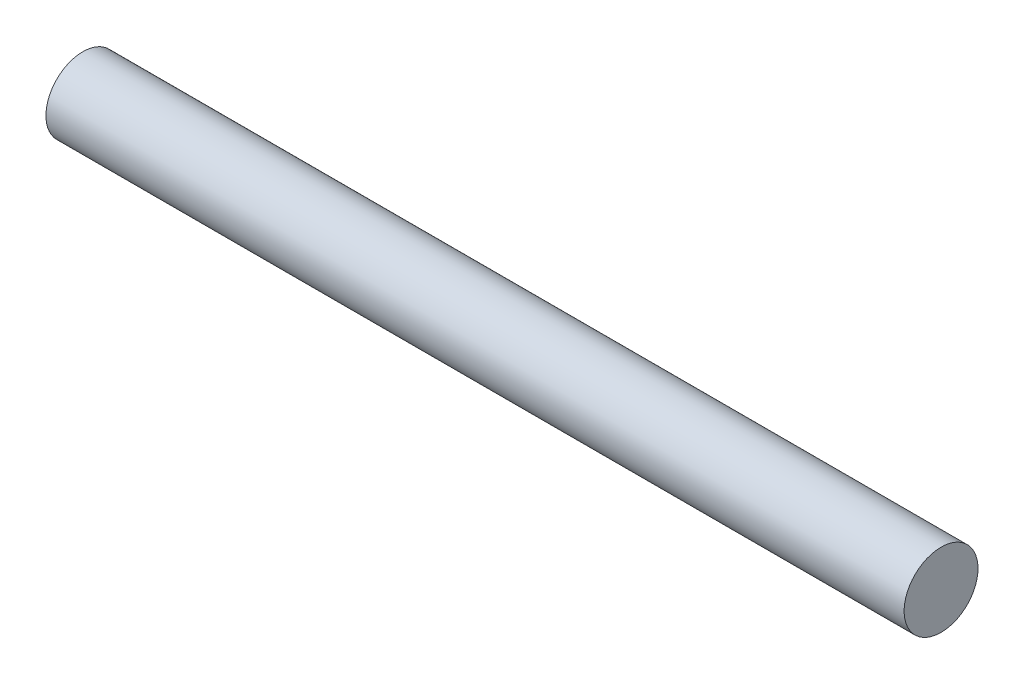
ISO-10303-21;
HEADER;
FILE_DESCRIPTION(('STEP AP214'),'2;1');
FILE_NAME('part.step','',(''),(''),'','','');
FILE_SCHEMA(('AUTOMOTIVE_DESIGN { 1 0 10303 214 1 1 1 1 }'));
ENDSEC;
DATA;
#1=APPLICATION_CONTEXT('core data for automotive mechanical design processes');
#2=APPLICATION_PROTOCOL_DEFINITION('international standard','automotive_design',2000,#1);
#3=PRODUCT_CONTEXT('',#1,'mechanical');
#4=PRODUCT('Part','Part','',(#3));
#5=PRODUCT_RELATED_PRODUCT_CATEGORY('part','',(#4));
#6=PRODUCT_DEFINITION_FORMATION('','',#4);
#7=PRODUCT_DEFINITION_CONTEXT('part definition',#1,'design');
#8=PRODUCT_DEFINITION('design','',#6,#7);
#9=PRODUCT_DEFINITION_SHAPE('','',#8);
#10=(LENGTH_UNIT() NAMED_UNIT(*) SI_UNIT(.MILLI.,.METRE.));
#11=(NAMED_UNIT(*) PLANE_ANGLE_UNIT() SI_UNIT($,.RADIAN.));
#12=(NAMED_UNIT(*) SI_UNIT($,.STERADIAN.) SOLID_ANGLE_UNIT());
#13=UNCERTAINTY_MEASURE_WITH_UNIT(LENGTH_MEASURE(1.E-05),#10,'distance_accuracy_value','');
#14=(GEOMETRIC_REPRESENTATION_CONTEXT(3) GLOBAL_UNCERTAINTY_ASSIGNED_CONTEXT((#13)) GLOBAL_UNIT_ASSIGNED_CONTEXT((#10,
#11,#12)) REPRESENTATION_CONTEXT('',''));
#15=CARTESIAN_POINT('',(0.,0.,0.));
#16=DIRECTION('',(0.,0.,1.));
#17=DIRECTION('',(1.,0.,0.));
#18=AXIS2_PLACEMENT_3D('',#15,#16,#17);
#19=CARTESIAN_POINT('',(230.,0.,0.));
#20=DIRECTION('',(-1.,0.,0.));
#21=DIRECTION('',(0.,0.,1.));
#22=AXIS2_PLACEMENT_3D('',#19,#20,#21);
#23=CYLINDRICAL_SURFACE('',#22,9.9);
#24=CARTESIAN_POINT('',(230.,0.,0.));
#25=DIRECTION('',(1.,0.,0.));
#26=DIRECTION('',(0.,0.,-1.));
#27=AXIS2_PLACEMENT_3D('',#24,#25,#26);
#28=CIRCLE('',#27,9.9);
#29=CARTESIAN_POINT('',(230.,0.,-9.9));
#30=VERTEX_POINT('',#29);
#31=EDGE_CURVE('E10',#30,#30,#28,.T.);
#32=ORIENTED_EDGE('',*,*,#31,.F.);
#33=EDGE_LOOP('',(#32));
#34=FACE_BOUND('',#33,.T.);
#35=CARTESIAN_POINT('',(0.,0.,0.));
#36=DIRECTION('',(1.,0.,0.));
#37=DIRECTION('',(0.,0.,-1.));
#38=AXIS2_PLACEMENT_3D('',#35,#36,#37);
#39=CIRCLE('',#38,9.9);
#40=CARTESIAN_POINT('',(0.,0.,-9.9));
#41=VERTEX_POINT('',#40);
#42=EDGE_CURVE('E42',#41,#41,#39,.T.);
#43=ORIENTED_EDGE('',*,*,#42,.T.);
#44=EDGE_LOOP('',(#43));
#45=FACE_BOUND('',#44,.T.);
#46=ADVANCED_FACE('F39',(#34,#45),#23,.T.);
#47=CARTESIAN_POINT('',(230.,0.,0.));
#48=DIRECTION('',(1.,0.,0.));
#49=DIRECTION('',(0.,0.,-1.));
#50=AXIS2_PLACEMENT_3D('',#47,#48,#49);
#51=PLANE('',#50);
#52=ORIENTED_EDGE('',*,*,#31,.T.);
#53=EDGE_LOOP('',(#52));
#54=FACE_BOUND('',#53,.T.);
#55=ADVANCED_FACE('F54',(#54),#51,.T.);
#56=CARTESIAN_POINT('',(0.,0.,0.));
#57=DIRECTION('',(1.,0.,0.));
#58=DIRECTION('',(0.,0.,-1.));
#59=AXIS2_PLACEMENT_3D('',#56,#57,#58);
#60=PLANE('',#59);
#61=ORIENTED_EDGE('',*,*,#42,.F.);
#62=EDGE_LOOP('',(#61));
#63=FACE_BOUND('',#62,.T.);
#64=ADVANCED_FACE('F52',(#63),#60,.F.);
#65=CLOSED_SHELL('',(#46,#55,#64));
#66=MANIFOLD_SOLID_BREP('B2',#65);
#67=ADVANCED_BREP_SHAPE_REPRESENTATION('',(#18,#66),#14);
#68=SHAPE_DEFINITION_REPRESENTATION(#9,#67);
ENDSEC;
END-ISO-10303-21;
